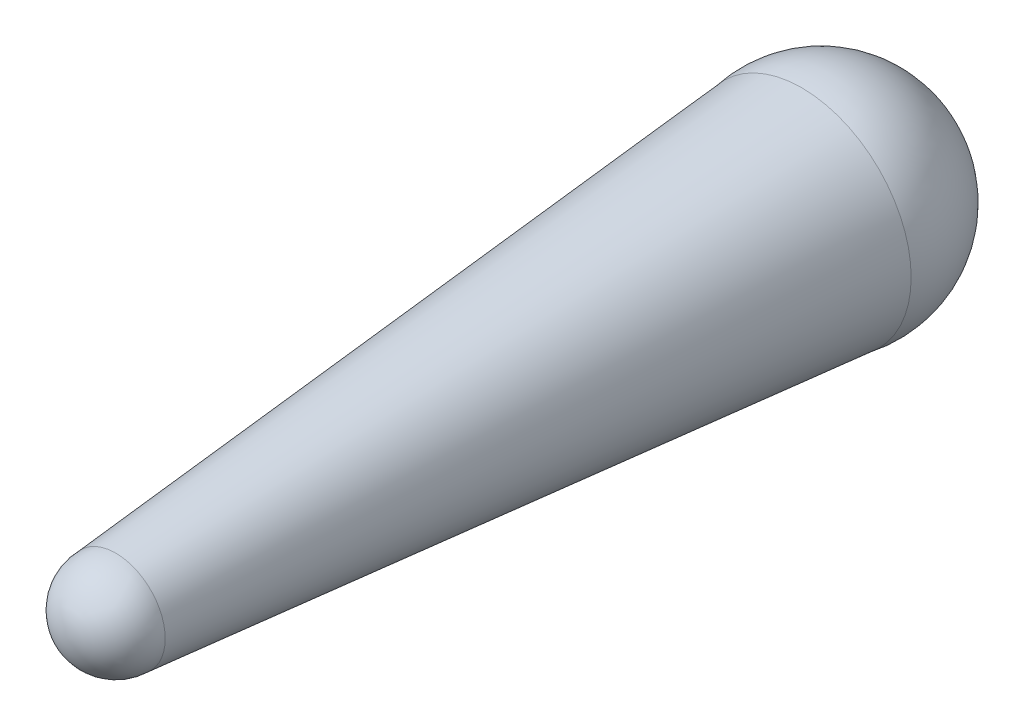
ISO-10303-21;
HEADER;
FILE_DESCRIPTION(('STEP AP214'),'2;1');
FILE_NAME('part.step','',(''),(''),'','','');
FILE_SCHEMA(('AUTOMOTIVE_DESIGN { 1 0 10303 214 1 1 1 1 }'));
ENDSEC;
DATA;
#1=APPLICATION_CONTEXT('core data for automotive mechanical design processes');
#2=APPLICATION_PROTOCOL_DEFINITION('international standard','automotive_design',2000,#1);
#3=PRODUCT_CONTEXT('',#1,'mechanical');
#4=PRODUCT('Part','Part','',(#3));
#5=PRODUCT_RELATED_PRODUCT_CATEGORY('part','',(#4));
#6=PRODUCT_DEFINITION_FORMATION('','',#4);
#7=PRODUCT_DEFINITION_CONTEXT('part definition',#1,'design');
#8=PRODUCT_DEFINITION('design','',#6,#7);
#9=PRODUCT_DEFINITION_SHAPE('','',#8);
#10=(LENGTH_UNIT() NAMED_UNIT(*) SI_UNIT(.MILLI.,.METRE.));
#11=(NAMED_UNIT(*) PLANE_ANGLE_UNIT() SI_UNIT($,.RADIAN.));
#12=(NAMED_UNIT(*) SI_UNIT($,.STERADIAN.) SOLID_ANGLE_UNIT());
#13=UNCERTAINTY_MEASURE_WITH_UNIT(LENGTH_MEASURE(1.E-05),#10,'distance_accuracy_value','');
#14=(GEOMETRIC_REPRESENTATION_CONTEXT(3) GLOBAL_UNCERTAINTY_ASSIGNED_CONTEXT((#13)) GLOBAL_UNIT_ASSIGNED_CONTEXT((#10,
#11,#12)) REPRESENTATION_CONTEXT('',''));
#15=CARTESIAN_POINT('',(0.,0.,0.));
#16=DIRECTION('',(0.,0.,1.));
#17=DIRECTION('',(1.,0.,0.));
#18=AXIS2_PLACEMENT_3D('',#15,#16,#17);
#19=CARTESIAN_POINT('',(0.,0.,0.));
#20=DIRECTION('',(0.,1.,0.));
#21=DIRECTION('',(1.,0.,0.));
#22=AXIS2_PLACEMENT_3D('',#19,#20,#21);
#23=SPHERICAL_SURFACE('',#22,1.575);
#24=CARTESIAN_POINT('',(0.,0.,0.));
#25=DIRECTION('',(0.,0.,-1.));
#26=DIRECTION('',(-1.,0.,0.));
#27=AXIS2_PLACEMENT_3D('',#24,#25,#26);
#28=SPHERICAL_SURFACE('',#27,1.575);
#29=CARTESIAN_POINT('',(0.,0.,0.273495879825535));
#30=DIRECTION('',(0.,0.,-1.));
#31=DIRECTION('',(-1.,0.,0.));
#32=AXIS2_PLACEMENT_3D('',#29,#30,#31);
#33=CIRCLE('',#32,1.55107221099422);
#34=CARTESIAN_POINT('',(-1.55107221099422,0.,0.273495879825535));
#35=VERTEX_POINT('',#34);
#36=EDGE_CURVE('E10',#35,#35,#33,.F.);
#37=ORIENTED_EDGE('',*,*,#36,.F.);
#38=EDGE_LOOP('',(#37));
#39=FACE_BOUND('',#38,.T.);
#40=ADVANCED_FACE('F33',(#39),#28,.T.);
#41=CARTESIAN_POINT('',(0.,0.,0.));
#42=DIRECTION('',(0.,0.,-1.));
#43=DIRECTION('',(1.,0.,0.));
#44=AXIS2_PLACEMENT_3D('',#41,#42,#43);
#45=CONICAL_SURFACE('',#44,1.575,0.0872664625997165);
#46=CARTESIAN_POINT('',(0.,0.,10.));
#47=DIRECTION('',(0.,0.,1.));
#48=DIRECTION('',(1.,0.,0.));
#49=AXIS2_PLACEMENT_3D('',#46,#47,#48);
#50=CIRCLE('',#49,0.70011336474076);
#51=CARTESIAN_POINT('',(0.70011336474076,0.,10.));
#52=VERTEX_POINT('',#51);
#53=EDGE_CURVE('E39',#52,#52,#50,.T.);
#54=ORIENTED_EDGE('',*,*,#53,.F.);
#55=EDGE_LOOP('',(#54));
#56=FACE_BOUND('',#55,.T.);
#57=ORIENTED_EDGE('',*,*,#36,.T.);
#58=EDGE_LOOP('',(#57));
#59=FACE_BOUND('',#58,.T.);
#60=ADVANCED_FACE('F47',(#56,#59),#45,.T.);
#61=CARTESIAN_POINT('',(0.,0.,10.));
#62=DIRECTION('',(0.,1.,0.));
#63=DIRECTION('',(1.,0.,0.));
#64=AXIS2_PLACEMENT_3D('',#61,#62,#63);
#65=SPHERICAL_SURFACE('',#64,0.70011336474076);
#66=CARTESIAN_POINT('',(0.,0.,10.));
#67=DIRECTION('',(0.,0.,1.));
#68=DIRECTION('',(1.,0.,0.));
#69=AXIS2_PLACEMENT_3D('',#66,#67,#68);
#70=SPHERICAL_SURFACE('',#69,0.70011336474076);
#71=ORIENTED_EDGE('',*,*,#53,.T.);
#72=EDGE_LOOP('',(#71));
#73=FACE_BOUND('',#72,.T.);
#74=ADVANCED_FACE('F45',(#73),#70,.T.);
#75=CLOSED_SHELL('',(#40,#60,#74));
#76=MANIFOLD_SOLID_BREP('B2',#75);
#77=ADVANCED_BREP_SHAPE_REPRESENTATION('',(#18,#76),#14);
#78=SHAPE_DEFINITION_REPRESENTATION(#9,#77);
ENDSEC;
END-ISO-10303-21;
